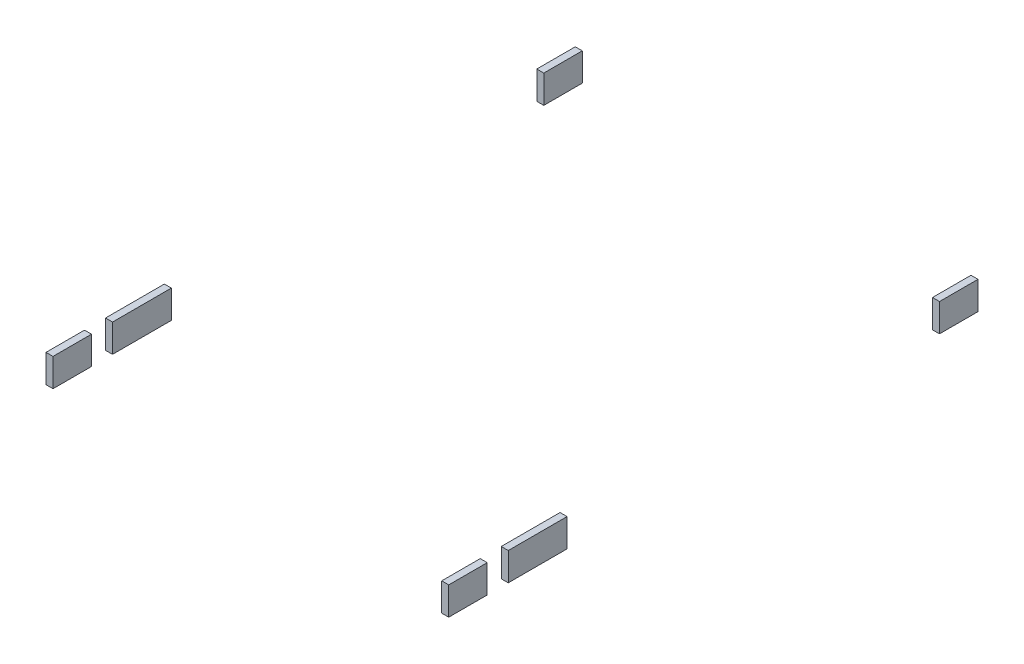
ISO-10303-21;
HEADER;
FILE_DESCRIPTION(('STEP AP214'),'2;1');
FILE_NAME('part.step','',(''),(''),'','','');
FILE_SCHEMA(('AUTOMOTIVE_DESIGN { 1 0 10303 214 1 1 1 1 }'));
ENDSEC;
DATA;
#1=APPLICATION_CONTEXT('core data for automotive mechanical design processes');
#2=APPLICATION_PROTOCOL_DEFINITION('international standard','automotive_design',2000,#1);
#3=PRODUCT_CONTEXT('',#1,'mechanical');
#4=PRODUCT('Part','Part','',(#3));
#5=PRODUCT_RELATED_PRODUCT_CATEGORY('part','',(#4));
#6=PRODUCT_DEFINITION_FORMATION('','',#4);
#7=PRODUCT_DEFINITION_CONTEXT('part definition',#1,'design');
#8=PRODUCT_DEFINITION('design','',#6,#7);
#9=PRODUCT_DEFINITION_SHAPE('','',#8);
#10=(LENGTH_UNIT() NAMED_UNIT(*) SI_UNIT(.MILLI.,.METRE.));
#11=(NAMED_UNIT(*) PLANE_ANGLE_UNIT() SI_UNIT($,.RADIAN.));
#12=(NAMED_UNIT(*) SI_UNIT($,.STERADIAN.) SOLID_ANGLE_UNIT());
#13=UNCERTAINTY_MEASURE_WITH_UNIT(LENGTH_MEASURE(1.E-05),#10,'distance_accuracy_value','');
#14=(GEOMETRIC_REPRESENTATION_CONTEXT(3) GLOBAL_UNCERTAINTY_ASSIGNED_CONTEXT((#13)) GLOBAL_UNIT_ASSIGNED_CONTEXT((#10,
#11,#12)) REPRESENTATION_CONTEXT('',''));
#15=CARTESIAN_POINT('',(0.,0.,0.));
#16=DIRECTION('',(0.,0.,1.));
#17=DIRECTION('',(1.,0.,0.));
#18=AXIS2_PLACEMENT_3D('',#15,#16,#17);
#19=CARTESIAN_POINT('',(-287.55,300.,670.));
#20=DIRECTION('',(0.,0.,-1.));
#21=DIRECTION('',(1.,0.,0.));
#22=AXIS2_PLACEMENT_3D('',#19,#20,#21);
#23=PLANE('',#22);
#24=DIRECTION('',(1.,0.,0.));
#25=VECTOR('',#24,1.);
#26=CARTESIAN_POINT('',(-287.55,300.,670.));
#27=LINE('',#26,#25);
#28=CARTESIAN_POINT('',(-287.55,300.,670.));
#29=VERTEX_POINT('',#28);
#30=CARTESIAN_POINT('',(-277.55,300.,670.));
#31=VERTEX_POINT('',#30);
#32=EDGE_CURVE('P0_E11',#29,#31,#27,.T.);
#33=ORIENTED_EDGE('',*,*,#32,.T.);
#34=DIRECTION('',(0.,1.,0.));
#35=VECTOR('',#34,1.);
#36=CARTESIAN_POINT('',(-277.55,300.,670.));
#37=LINE('',#36,#35);
#38=CARTESIAN_POINT('',(-277.55,340.,670.));
#39=VERTEX_POINT('',#38);
#40=EDGE_CURVE('P0_E26',#31,#39,#37,.T.);
#41=ORIENTED_EDGE('',*,*,#40,.T.);
#42=DIRECTION('',(1.,0.,0.));
#43=VECTOR('',#42,1.);
#44=CARTESIAN_POINT('',(-287.55,340.,670.));
#45=LINE('',#44,#43);
#46=CARTESIAN_POINT('',(-287.55,340.,670.));
#47=VERTEX_POINT('',#46);
#48=EDGE_CURVE('P0_E77',#47,#39,#45,.T.);
#49=ORIENTED_EDGE('',*,*,#48,.F.);
#50=DIRECTION('',(0.,1.,0.));
#51=VECTOR('',#50,1.);
#52=CARTESIAN_POINT('',(-287.55,300.,670.));
#53=LINE('',#52,#51);
#54=EDGE_CURVE('P0_E74',#29,#47,#53,.T.);
#55=ORIENTED_EDGE('',*,*,#54,.F.);
#56=EDGE_LOOP('',(#33,#41,#49,#55));
#57=FACE_BOUND('',#56,.T.);
#58=ADVANCED_FACE('P0_F16',(#57),#23,.F.);
#59=CARTESIAN_POINT('',(-277.55,300.,670.));
#60=DIRECTION('',(-1.,0.,0.));
#61=DIRECTION('',(0.,0.,-1.));
#62=AXIS2_PLACEMENT_3D('',#59,#60,#61);
#63=PLANE('',#62);
#64=DIRECTION('',(0.,0.,-1.));
#65=VECTOR('',#64,1.);
#66=CARTESIAN_POINT('',(-277.55,300.,670.));
#67=LINE('',#66,#65);
#68=CARTESIAN_POINT('',(-277.55,300.,615.));
#69=VERTEX_POINT('',#68);
#70=EDGE_CURVE('P0_E82',#31,#69,#67,.T.);
#71=ORIENTED_EDGE('',*,*,#70,.T.);
#72=DIRECTION('',(0.,1.,0.));
#73=VECTOR('',#72,1.);
#74=CARTESIAN_POINT('',(-277.55,300.,615.));
#75=LINE('',#74,#73);
#76=CARTESIAN_POINT('',(-277.55,340.,615.));
#77=VERTEX_POINT('',#76);
#78=EDGE_CURVE('P0_E84',#69,#77,#75,.T.);
#79=ORIENTED_EDGE('',*,*,#78,.T.);
#80=DIRECTION('',(0.,0.,-1.));
#81=VECTOR('',#80,1.);
#82=CARTESIAN_POINT('',(-277.55,340.,670.));
#83=LINE('',#82,#81);
#84=EDGE_CURVE('P0_E61',#39,#77,#83,.T.);
#85=ORIENTED_EDGE('',*,*,#84,.F.);
#86=ORIENTED_EDGE('',*,*,#40,.F.);
#87=EDGE_LOOP('',(#71,#79,#85,#86));
#88=FACE_BOUND('',#87,.T.);
#89=ADVANCED_FACE('P0_F87',(#88),#63,.F.);
#90=CARTESIAN_POINT('',(-277.55,300.,615.));
#91=DIRECTION('',(0.,0.,1.));
#92=DIRECTION('',(-1.,0.,0.));
#93=AXIS2_PLACEMENT_3D('',#90,#91,#92);
#94=PLANE('',#93);
#95=DIRECTION('',(-1.,0.,0.));
#96=VECTOR('',#95,1.);
#97=CARTESIAN_POINT('',(-277.55,300.,615.));
#98=LINE('',#97,#96);
#99=CARTESIAN_POINT('',(-287.55,300.,615.));
#100=VERTEX_POINT('',#99);
#101=EDGE_CURVE('P0_E67',#69,#100,#98,.T.);
#102=ORIENTED_EDGE('',*,*,#101,.T.);
#103=DIRECTION('',(0.,1.,0.));
#104=VECTOR('',#103,1.);
#105=CARTESIAN_POINT('',(-287.55,300.,615.));
#106=LINE('',#105,#104);
#107=CARTESIAN_POINT('',(-287.55,340.,615.));
#108=VERTEX_POINT('',#107);
#109=EDGE_CURVE('P0_E54',#100,#108,#106,.T.);
#110=ORIENTED_EDGE('',*,*,#109,.T.);
#111=DIRECTION('',(-1.,0.,0.));
#112=VECTOR('',#111,1.);
#113=CARTESIAN_POINT('',(-277.55,340.,615.));
#114=LINE('',#113,#112);
#115=EDGE_CURVE('P0_E60',#77,#108,#114,.T.);
#116=ORIENTED_EDGE('',*,*,#115,.F.);
#117=ORIENTED_EDGE('',*,*,#78,.F.);
#118=EDGE_LOOP('',(#102,#110,#116,#117));
#119=FACE_BOUND('',#118,.T.);
#120=ADVANCED_FACE('P0_F65',(#119),#94,.F.);
#121=CARTESIAN_POINT('',(-287.55,300.,615.));
#122=DIRECTION('',(1.,0.,0.));
#123=DIRECTION('',(0.,0.,1.));
#124=AXIS2_PLACEMENT_3D('',#121,#122,#123);
#125=PLANE('',#124);
#126=DIRECTION('',(0.,0.,1.));
#127=VECTOR('',#126,1.);
#128=CARTESIAN_POINT('',(-287.55,300.,615.));
#129=LINE('',#128,#127);
#130=EDGE_CURVE('P0_E69',#100,#29,#129,.T.);
#131=ORIENTED_EDGE('',*,*,#130,.T.);
#132=ORIENTED_EDGE('',*,*,#54,.T.);
#133=DIRECTION('',(0.,0.,1.));
#134=VECTOR('',#133,1.);
#135=CARTESIAN_POINT('',(-287.55,340.,615.));
#136=LINE('',#135,#134);
#137=EDGE_CURVE('P0_E20',#108,#47,#136,.T.);
#138=ORIENTED_EDGE('',*,*,#137,.F.);
#139=ORIENTED_EDGE('',*,*,#109,.F.);
#140=EDGE_LOOP('',(#131,#132,#138,#139));
#141=FACE_BOUND('',#140,.T.);
#142=ADVANCED_FACE('P0_F72',(#141),#125,.F.);
#143=CARTESIAN_POINT('',(0.,300.,1098.183990133));
#144=DIRECTION('',(0.,1.,0.));
#145=DIRECTION('',(0.,0.,1.));
#146=AXIS2_PLACEMENT_3D('',#143,#144,#145);
#147=PLANE('',#146);
#148=ORIENTED_EDGE('',*,*,#130,.F.);
#149=ORIENTED_EDGE('',*,*,#101,.F.);
#150=ORIENTED_EDGE('',*,*,#70,.F.);
#151=ORIENTED_EDGE('',*,*,#32,.F.);
#152=EDGE_LOOP('',(#148,#149,#150,#151));
#153=FACE_BOUND('',#152,.T.);
#154=ADVANCED_FACE('P0_F90',(#153),#147,.F.);
#155=CARTESIAN_POINT('',(0.,340.,1098.183990133));
#156=DIRECTION('',(0.,1.,0.));
#157=DIRECTION('',(0.,0.,1.));
#158=AXIS2_PLACEMENT_3D('',#155,#156,#157);
#159=PLANE('',#158);
#160=ORIENTED_EDGE('',*,*,#48,.T.);
#161=ORIENTED_EDGE('',*,*,#84,.T.);
#162=ORIENTED_EDGE('',*,*,#115,.T.);
#163=ORIENTED_EDGE('',*,*,#137,.T.);
#164=EDGE_LOOP('',(#160,#161,#162,#163));
#165=FACE_BOUND('',#164,.T.);
#166=ADVANCED_FACE('P0_F18',(#165),#159,.T.);
#167=CLOSED_SHELL('',(#58,#89,#120,#142,#154,#166));
#168=MANIFOLD_SOLID_BREP('P0_B1',#167);
#169=CARTESIAN_POINT('',(287.55,300.,1370.8));
#170=DIRECTION('',(0.,0.,1.));
#171=DIRECTION('',(-1.,0.,0.));
#172=AXIS2_PLACEMENT_3D('',#169,#170,#171);
#173=PLANE('',#172);
#174=DIRECTION('',(0.,1.,0.));
#175=VECTOR('',#174,1.);
#176=CARTESIAN_POINT('',(287.55,300.,1370.8));
#177=LINE('',#176,#175);
#178=CARTESIAN_POINT('',(287.55,300.,1370.8));
#179=VERTEX_POINT('',#178);
#180=CARTESIAN_POINT('',(287.55,340.,1370.8));
#181=VERTEX_POINT('',#180);
#182=EDGE_CURVE('P1_E11',#179,#181,#177,.T.);
#183=ORIENTED_EDGE('',*,*,#182,.T.);
#184=DIRECTION('',(-1.,0.,0.));
#185=VECTOR('',#184,1.);
#186=CARTESIAN_POINT('',(287.55,340.,1370.8));
#187=LINE('',#186,#185);
#188=CARTESIAN_POINT('',(277.55,340.,1370.8));
#189=VERTEX_POINT('',#188);
#190=EDGE_CURVE('P1_E26',#181,#189,#187,.T.);
#191=ORIENTED_EDGE('',*,*,#190,.T.);
#192=DIRECTION('',(0.,1.,0.));
#193=VECTOR('',#192,1.);
#194=CARTESIAN_POINT('',(277.55,300.,1370.8));
#195=LINE('',#194,#193);
#196=CARTESIAN_POINT('',(277.55,300.,1370.8));
#197=VERTEX_POINT('',#196);
#198=EDGE_CURVE('P1_E78',#197,#189,#195,.T.);
#199=ORIENTED_EDGE('',*,*,#198,.F.);
#200=DIRECTION('',(-1.,0.,0.));
#201=VECTOR('',#200,1.);
#202=CARTESIAN_POINT('',(287.55,300.,1370.8));
#203=LINE('',#202,#201);
#204=EDGE_CURVE('P1_E77',#179,#197,#203,.T.);
#205=ORIENTED_EDGE('',*,*,#204,.F.);
#206=EDGE_LOOP('',(#183,#191,#199,#205));
#207=FACE_BOUND('',#206,.T.);
#208=ADVANCED_FACE('P1_F16',(#207),#173,.T.);
#209=CARTESIAN_POINT('',(277.55,300.,1370.8));
#210=DIRECTION('',(-1.,0.,0.));
#211=DIRECTION('',(0.,0.,-1.));
#212=AXIS2_PLACEMENT_3D('',#209,#210,#211);
#213=PLANE('',#212);
#214=ORIENTED_EDGE('',*,*,#198,.T.);
#215=DIRECTION('',(0.,0.,-1.));
#216=VECTOR('',#215,1.);
#217=CARTESIAN_POINT('',(277.55,340.,1370.8));
#218=LINE('',#217,#216);
#219=CARTESIAN_POINT('',(277.55,340.,1315.8));
#220=VERTEX_POINT('',#219);
#221=EDGE_CURVE('P1_E84',#189,#220,#218,.T.);
#222=ORIENTED_EDGE('',*,*,#221,.T.);
#223=DIRECTION('',(0.,1.,0.));
#224=VECTOR('',#223,1.);
#225=CARTESIAN_POINT('',(277.55,300.,1315.8));
#226=LINE('',#225,#224);
#227=CARTESIAN_POINT('',(277.55,300.,1315.8));
#228=VERTEX_POINT('',#227);
#229=EDGE_CURVE('P1_E87',#228,#220,#226,.T.);
#230=ORIENTED_EDGE('',*,*,#229,.F.);
#231=DIRECTION('',(0.,0.,-1.));
#232=VECTOR('',#231,1.);
#233=CARTESIAN_POINT('',(277.55,300.,1370.8));
#234=LINE('',#233,#232);
#235=EDGE_CURVE('P1_E63',#197,#228,#234,.T.);
#236=ORIENTED_EDGE('',*,*,#235,.F.);
#237=EDGE_LOOP('',(#214,#222,#230,#236));
#238=FACE_BOUND('',#237,.T.);
#239=ADVANCED_FACE('P1_F90',(#238),#213,.T.);
#240=CARTESIAN_POINT('',(277.55,300.,1315.8));
#241=DIRECTION('',(0.,0.,-1.));
#242=DIRECTION('',(1.,0.,0.));
#243=AXIS2_PLACEMENT_3D('',#240,#241,#242);
#244=PLANE('',#243);
#245=ORIENTED_EDGE('',*,*,#229,.T.);
#246=DIRECTION('',(1.,0.,0.));
#247=VECTOR('',#246,1.);
#248=CARTESIAN_POINT('',(277.55,340.,1315.8));
#249=LINE('',#248,#247);
#250=CARTESIAN_POINT('',(287.55,340.,1315.8));
#251=VERTEX_POINT('',#250);
#252=EDGE_CURVE('P1_E69',#220,#251,#249,.T.);
#253=ORIENTED_EDGE('',*,*,#252,.T.);
#254=DIRECTION('',(0.,1.,0.));
#255=VECTOR('',#254,1.);
#256=CARTESIAN_POINT('',(287.55,300.,1315.8));
#257=LINE('',#256,#255);
#258=CARTESIAN_POINT('',(287.55,300.,1315.8));
#259=VERTEX_POINT('',#258);
#260=EDGE_CURVE('P1_E54',#259,#251,#257,.T.);
#261=ORIENTED_EDGE('',*,*,#260,.F.);
#262=DIRECTION('',(1.,0.,0.));
#263=VECTOR('',#262,1.);
#264=CARTESIAN_POINT('',(277.55,300.,1315.8));
#265=LINE('',#264,#263);
#266=EDGE_CURVE('P1_E60',#228,#259,#265,.T.);
#267=ORIENTED_EDGE('',*,*,#266,.F.);
#268=EDGE_LOOP('',(#245,#253,#261,#267));
#269=FACE_BOUND('',#268,.T.);
#270=ADVANCED_FACE('P1_F67',(#269),#244,.T.);
#271=CARTESIAN_POINT('',(287.55,300.,1315.8));
#272=DIRECTION('',(1.,0.,0.));
#273=DIRECTION('',(0.,0.,1.));
#274=AXIS2_PLACEMENT_3D('',#271,#272,#273);
#275=PLANE('',#274);
#276=ORIENTED_EDGE('',*,*,#260,.T.);
#277=DIRECTION('',(0.,0.,1.));
#278=VECTOR('',#277,1.);
#279=CARTESIAN_POINT('',(287.55,340.,1315.8));
#280=LINE('',#279,#278);
#281=EDGE_CURVE('P1_E70',#251,#181,#280,.T.);
#282=ORIENTED_EDGE('',*,*,#281,.T.);
#283=ORIENTED_EDGE('',*,*,#182,.F.);
#284=DIRECTION('',(0.,0.,1.));
#285=VECTOR('',#284,1.);
#286=CARTESIAN_POINT('',(287.55,300.,1315.8));
#287=LINE('',#286,#285);
#288=EDGE_CURVE('P1_E20',#259,#179,#287,.T.);
#289=ORIENTED_EDGE('',*,*,#288,.F.);
#290=EDGE_LOOP('',(#276,#282,#283,#289));
#291=FACE_BOUND('',#290,.T.);
#292=ADVANCED_FACE('P1_F73',(#291),#275,.T.);
#293=CARTESIAN_POINT('',(0.,300.,1098.183990133));
#294=DIRECTION('',(0.,1.,0.));
#295=DIRECTION('',(0.,0.,1.));
#296=AXIS2_PLACEMENT_3D('',#293,#294,#295);
#297=PLANE('',#296);
#298=ORIENTED_EDGE('',*,*,#204,.T.);
#299=ORIENTED_EDGE('',*,*,#235,.T.);
#300=ORIENTED_EDGE('',*,*,#266,.T.);
#301=ORIENTED_EDGE('',*,*,#288,.T.);
#302=EDGE_LOOP('',(#298,#299,#300,#301));
#303=FACE_BOUND('',#302,.T.);
#304=ADVANCED_FACE('P1_F61',(#303),#297,.F.);
#305=CARTESIAN_POINT('',(0.,340.,1098.183990133));
#306=DIRECTION('',(0.,1.,0.));
#307=DIRECTION('',(0.,0.,1.));
#308=AXIS2_PLACEMENT_3D('',#305,#306,#307);
#309=PLANE('',#308);
#310=ORIENTED_EDGE('',*,*,#281,.F.);
#311=ORIENTED_EDGE('',*,*,#252,.F.);
#312=ORIENTED_EDGE('',*,*,#221,.F.);
#313=ORIENTED_EDGE('',*,*,#190,.F.);
#314=EDGE_LOOP('',(#310,#311,#312,#313));
#315=FACE_BOUND('',#314,.T.);
#316=ADVANCED_FACE('P1_F18',(#315),#309,.T.);
#317=CLOSED_SHELL('',(#208,#239,#270,#292,#304,#316));
#318=MANIFOLD_SOLID_BREP('P1_B1',#317);
#319=CARTESIAN_POINT('',(287.55,300.,1201.81));
#320=DIRECTION('',(0.,0.,1.));
#321=DIRECTION('',(-1.,0.,0.));
#322=AXIS2_PLACEMENT_3D('',#319,#320,#321);
#323=PLANE('',#322);
#324=DIRECTION('',(-1.,0.,0.));
#325=VECTOR('',#324,1.);
#326=CARTESIAN_POINT('',(287.55,300.,1201.81));
#327=LINE('',#326,#325);
#328=CARTESIAN_POINT('',(287.55,300.,1201.81));
#329=VERTEX_POINT('',#328);
#330=CARTESIAN_POINT('',(277.55,300.,1201.81));
#331=VERTEX_POINT('',#330);
#332=EDGE_CURVE('P2_E11',#329,#331,#327,.T.);
#333=ORIENTED_EDGE('',*,*,#332,.T.);
#334=DIRECTION('',(0.,1.,0.));
#335=VECTOR('',#334,1.);
#336=CARTESIAN_POINT('',(277.55,300.,1201.81));
#337=LINE('',#336,#335);
#338=CARTESIAN_POINT('',(277.55,340.,1201.81));
#339=VERTEX_POINT('',#338);
#340=EDGE_CURVE('P2_E26',#331,#339,#337,.T.);
#341=ORIENTED_EDGE('',*,*,#340,.T.);
#342=DIRECTION('',(-1.,0.,0.));
#343=VECTOR('',#342,1.);
#344=CARTESIAN_POINT('',(287.55,340.,1201.81));
#345=LINE('',#344,#343);
#346=CARTESIAN_POINT('',(287.55,340.,1201.81));
#347=VERTEX_POINT('',#346);
#348=EDGE_CURVE('P2_E77',#347,#339,#345,.T.);
#349=ORIENTED_EDGE('',*,*,#348,.F.);
#350=DIRECTION('',(0.,1.,0.));
#351=VECTOR('',#350,1.);
#352=CARTESIAN_POINT('',(287.55,300.,1201.81));
#353=LINE('',#352,#351);
#354=EDGE_CURVE('P2_E74',#329,#347,#353,.T.);
#355=ORIENTED_EDGE('',*,*,#354,.F.);
#356=EDGE_LOOP('',(#333,#341,#349,#355));
#357=FACE_BOUND('',#356,.T.);
#358=ADVANCED_FACE('P2_F16',(#357),#323,.F.);
#359=CARTESIAN_POINT('',(277.55,300.,1201.81));
#360=DIRECTION('',(1.,0.,0.));
#361=DIRECTION('',(0.,0.,1.));
#362=AXIS2_PLACEMENT_3D('',#359,#360,#361);
#363=PLANE('',#362);
#364=DIRECTION('',(0.,0.,1.));
#365=VECTOR('',#364,1.);
#366=CARTESIAN_POINT('',(277.55,300.,1201.81));
#367=LINE('',#366,#365);
#368=CARTESIAN_POINT('',(277.55,300.,1285.8));
#369=VERTEX_POINT('',#368);
#370=EDGE_CURVE('P2_E82',#331,#369,#367,.T.);
#371=ORIENTED_EDGE('',*,*,#370,.T.);
#372=DIRECTION('',(0.,1.,0.));
#373=VECTOR('',#372,1.);
#374=CARTESIAN_POINT('',(277.55,300.,1285.8));
#375=LINE('',#374,#373);
#376=CARTESIAN_POINT('',(277.55,340.,1285.8));
#377=VERTEX_POINT('',#376);
#378=EDGE_CURVE('P2_E84',#369,#377,#375,.T.);
#379=ORIENTED_EDGE('',*,*,#378,.T.);
#380=DIRECTION('',(0.,0.,1.));
#381=VECTOR('',#380,1.);
#382=CARTESIAN_POINT('',(277.55,340.,1201.81));
#383=LINE('',#382,#381);
#384=EDGE_CURVE('P2_E61',#339,#377,#383,.T.);
#385=ORIENTED_EDGE('',*,*,#384,.F.);
#386=ORIENTED_EDGE('',*,*,#340,.F.);
#387=EDGE_LOOP('',(#371,#379,#385,#386));
#388=FACE_BOUND('',#387,.T.);
#389=ADVANCED_FACE('P2_F87',(#388),#363,.F.);
#390=CARTESIAN_POINT('',(277.55,300.,1285.8));
#391=DIRECTION('',(0.,0.,-1.));
#392=DIRECTION('',(1.,0.,0.));
#393=AXIS2_PLACEMENT_3D('',#390,#391,#392);
#394=PLANE('',#393);
#395=DIRECTION('',(1.,0.,0.));
#396=VECTOR('',#395,1.);
#397=CARTESIAN_POINT('',(277.55,300.,1285.8));
#398=LINE('',#397,#396);
#399=CARTESIAN_POINT('',(287.55,300.,1285.8));
#400=VERTEX_POINT('',#399);
#401=EDGE_CURVE('P2_E67',#369,#400,#398,.T.);
#402=ORIENTED_EDGE('',*,*,#401,.T.);
#403=DIRECTION('',(0.,1.,0.));
#404=VECTOR('',#403,1.);
#405=CARTESIAN_POINT('',(287.55,300.,1285.8));
#406=LINE('',#405,#404);
#407=CARTESIAN_POINT('',(287.55,340.,1285.8));
#408=VERTEX_POINT('',#407);
#409=EDGE_CURVE('P2_E54',#400,#408,#406,.T.);
#410=ORIENTED_EDGE('',*,*,#409,.T.);
#411=DIRECTION('',(1.,0.,0.));
#412=VECTOR('',#411,1.);
#413=CARTESIAN_POINT('',(277.55,340.,1285.8));
#414=LINE('',#413,#412);
#415=EDGE_CURVE('P2_E60',#377,#408,#414,.T.);
#416=ORIENTED_EDGE('',*,*,#415,.F.);
#417=ORIENTED_EDGE('',*,*,#378,.F.);
#418=EDGE_LOOP('',(#402,#410,#416,#417));
#419=FACE_BOUND('',#418,.T.);
#420=ADVANCED_FACE('P2_F65',(#419),#394,.F.);
#421=CARTESIAN_POINT('',(287.55,300.,1285.8));
#422=DIRECTION('',(-1.,0.,0.));
#423=DIRECTION('',(0.,0.,-1.));
#424=AXIS2_PLACEMENT_3D('',#421,#422,#423);
#425=PLANE('',#424);
#426=DIRECTION('',(0.,0.,-1.));
#427=VECTOR('',#426,1.);
#428=CARTESIAN_POINT('',(287.55,300.,1285.8));
#429=LINE('',#428,#427);
#430=EDGE_CURVE('P2_E69',#400,#329,#429,.T.);
#431=ORIENTED_EDGE('',*,*,#430,.T.);
#432=ORIENTED_EDGE('',*,*,#354,.T.);
#433=DIRECTION('',(0.,0.,-1.));
#434=VECTOR('',#433,1.);
#435=CARTESIAN_POINT('',(287.55,340.,1285.8));
#436=LINE('',#435,#434);
#437=EDGE_CURVE('P2_E20',#408,#347,#436,.T.);
#438=ORIENTED_EDGE('',*,*,#437,.F.);
#439=ORIENTED_EDGE('',*,*,#409,.F.);
#440=EDGE_LOOP('',(#431,#432,#438,#439));
#441=FACE_BOUND('',#440,.T.);
#442=ADVANCED_FACE('P2_F72',(#441),#425,.F.);
#443=CARTESIAN_POINT('',(0.,300.,1098.183990133));
#444=DIRECTION('',(0.,1.,0.));
#445=DIRECTION('',(0.,0.,1.));
#446=AXIS2_PLACEMENT_3D('',#443,#444,#445);
#447=PLANE('',#446);
#448=ORIENTED_EDGE('',*,*,#430,.F.);
#449=ORIENTED_EDGE('',*,*,#401,.F.);
#450=ORIENTED_EDGE('',*,*,#370,.F.);
#451=ORIENTED_EDGE('',*,*,#332,.F.);
#452=EDGE_LOOP('',(#448,#449,#450,#451));
#453=FACE_BOUND('',#452,.T.);
#454=ADVANCED_FACE('P2_F90',(#453),#447,.F.);
#455=CARTESIAN_POINT('',(0.,340.,1098.183990133));
#456=DIRECTION('',(0.,1.,0.));
#457=DIRECTION('',(0.,0.,1.));
#458=AXIS2_PLACEMENT_3D('',#455,#456,#457);
#459=PLANE('',#458);
#460=ORIENTED_EDGE('',*,*,#348,.T.);
#461=ORIENTED_EDGE('',*,*,#384,.T.);
#462=ORIENTED_EDGE('',*,*,#415,.T.);
#463=ORIENTED_EDGE('',*,*,#437,.T.);
#464=EDGE_LOOP('',(#460,#461,#462,#463));
#465=FACE_BOUND('',#464,.T.);
#466=ADVANCED_FACE('P2_F18',(#465),#459,.T.);
#467=CLOSED_SHELL('',(#358,#389,#420,#442,#454,#466));
#468=MANIFOLD_SOLID_BREP('P2_B1',#467);
#469=CARTESIAN_POINT('',(-287.55,300.,1370.8));
#470=DIRECTION('',(0.,0.,-1.));
#471=DIRECTION('',(1.,0.,0.));
#472=AXIS2_PLACEMENT_3D('',#469,#470,#471);
#473=PLANE('',#472);
#474=DIRECTION('',(1.,0.,0.));
#475=VECTOR('',#474,1.);
#476=CARTESIAN_POINT('',(-287.55,300.,1370.8));
#477=LINE('',#476,#475);
#478=CARTESIAN_POINT('',(-287.55,300.,1370.8));
#479=VERTEX_POINT('',#478);
#480=CARTESIAN_POINT('',(-277.55,300.,1370.8));
#481=VERTEX_POINT('',#480);
#482=EDGE_CURVE('P3_E11',#479,#481,#477,.T.);
#483=ORIENTED_EDGE('',*,*,#482,.T.);
#484=DIRECTION('',(0.,1.,0.));
#485=VECTOR('',#484,1.);
#486=CARTESIAN_POINT('',(-277.55,300.,1370.8));
#487=LINE('',#486,#485);
#488=CARTESIAN_POINT('',(-277.55,340.,1370.8));
#489=VERTEX_POINT('',#488);
#490=EDGE_CURVE('P3_E26',#481,#489,#487,.T.);
#491=ORIENTED_EDGE('',*,*,#490,.T.);
#492=DIRECTION('',(1.,0.,0.));
#493=VECTOR('',#492,1.);
#494=CARTESIAN_POINT('',(-287.55,340.,1370.8));
#495=LINE('',#494,#493);
#496=CARTESIAN_POINT('',(-287.55,340.,1370.8));
#497=VERTEX_POINT('',#496);
#498=EDGE_CURVE('P3_E77',#497,#489,#495,.T.);
#499=ORIENTED_EDGE('',*,*,#498,.F.);
#500=DIRECTION('',(0.,1.,0.));
#501=VECTOR('',#500,1.);
#502=CARTESIAN_POINT('',(-287.55,300.,1370.8));
#503=LINE('',#502,#501);
#504=EDGE_CURVE('P3_E74',#479,#497,#503,.T.);
#505=ORIENTED_EDGE('',*,*,#504,.F.);
#506=EDGE_LOOP('',(#483,#491,#499,#505));
#507=FACE_BOUND('',#506,.T.);
#508=ADVANCED_FACE('P3_F16',(#507),#473,.F.);
#509=CARTESIAN_POINT('',(-277.55,300.,1370.8));
#510=DIRECTION('',(-1.,0.,0.));
#511=DIRECTION('',(0.,0.,-1.));
#512=AXIS2_PLACEMENT_3D('',#509,#510,#511);
#513=PLANE('',#512);
#514=DIRECTION('',(0.,0.,-1.));
#515=VECTOR('',#514,1.);
#516=CARTESIAN_POINT('',(-277.55,300.,1370.8));
#517=LINE('',#516,#515);
#518=CARTESIAN_POINT('',(-277.55,300.,1315.8));
#519=VERTEX_POINT('',#518);
#520=EDGE_CURVE('P3_E82',#481,#519,#517,.T.);
#521=ORIENTED_EDGE('',*,*,#520,.T.);
#522=DIRECTION('',(0.,1.,0.));
#523=VECTOR('',#522,1.);
#524=CARTESIAN_POINT('',(-277.55,300.,1315.8));
#525=LINE('',#524,#523);
#526=CARTESIAN_POINT('',(-277.55,340.,1315.8));
#527=VERTEX_POINT('',#526);
#528=EDGE_CURVE('P3_E84',#519,#527,#525,.T.);
#529=ORIENTED_EDGE('',*,*,#528,.T.);
#530=DIRECTION('',(0.,0.,-1.));
#531=VECTOR('',#530,1.);
#532=CARTESIAN_POINT('',(-277.55,340.,1370.8));
#533=LINE('',#532,#531);
#534=EDGE_CURVE('P3_E61',#489,#527,#533,.T.);
#535=ORIENTED_EDGE('',*,*,#534,.F.);
#536=ORIENTED_EDGE('',*,*,#490,.F.);
#537=EDGE_LOOP('',(#521,#529,#535,#536));
#538=FACE_BOUND('',#537,.T.);
#539=ADVANCED_FACE('P3_F87',(#538),#513,.F.);
#540=CARTESIAN_POINT('',(-277.55,300.,1315.8));
#541=DIRECTION('',(0.,0.,1.));
#542=DIRECTION('',(-1.,0.,0.));
#543=AXIS2_PLACEMENT_3D('',#540,#541,#542);
#544=PLANE('',#543);
#545=DIRECTION('',(-1.,0.,0.));
#546=VECTOR('',#545,1.);
#547=CARTESIAN_POINT('',(-277.55,300.,1315.8));
#548=LINE('',#547,#546);
#549=CARTESIAN_POINT('',(-287.55,300.,1315.8));
#550=VERTEX_POINT('',#549);
#551=EDGE_CURVE('P3_E67',#519,#550,#548,.T.);
#552=ORIENTED_EDGE('',*,*,#551,.T.);
#553=DIRECTION('',(0.,1.,0.));
#554=VECTOR('',#553,1.);
#555=CARTESIAN_POINT('',(-287.55,300.,1315.8));
#556=LINE('',#555,#554);
#557=CARTESIAN_POINT('',(-287.55,340.,1315.8));
#558=VERTEX_POINT('',#557);
#559=EDGE_CURVE('P3_E54',#550,#558,#556,.T.);
#560=ORIENTED_EDGE('',*,*,#559,.T.);
#561=DIRECTION('',(-1.,0.,0.));
#562=VECTOR('',#561,1.);
#563=CARTESIAN_POINT('',(-277.55,340.,1315.8));
#564=LINE('',#563,#562);
#565=EDGE_CURVE('P3_E60',#527,#558,#564,.T.);
#566=ORIENTED_EDGE('',*,*,#565,.F.);
#567=ORIENTED_EDGE('',*,*,#528,.F.);
#568=EDGE_LOOP('',(#552,#560,#566,#567));
#569=FACE_BOUND('',#568,.T.);
#570=ADVANCED_FACE('P3_F65',(#569),#544,.F.);
#571=CARTESIAN_POINT('',(-287.55,300.,1315.8));
#572=DIRECTION('',(1.,0.,0.));
#573=DIRECTION('',(0.,0.,1.));
#574=AXIS2_PLACEMENT_3D('',#571,#572,#573);
#575=PLANE('',#574);
#576=DIRECTION('',(0.,0.,1.));
#577=VECTOR('',#576,1.);
#578=CARTESIAN_POINT('',(-287.55,300.,1315.8));
#579=LINE('',#578,#577);
#580=EDGE_CURVE('P3_E69',#550,#479,#579,.T.);
#581=ORIENTED_EDGE('',*,*,#580,.T.);
#582=ORIENTED_EDGE('',*,*,#504,.T.);
#583=DIRECTION('',(0.,0.,1.));
#584=VECTOR('',#583,1.);
#585=CARTESIAN_POINT('',(-287.55,340.,1315.8));
#586=LINE('',#585,#584);
#587=EDGE_CURVE('P3_E20',#558,#497,#586,.T.);
#588=ORIENTED_EDGE('',*,*,#587,.F.);
#589=ORIENTED_EDGE('',*,*,#559,.F.);
#590=EDGE_LOOP('',(#581,#582,#588,#589));
#591=FACE_BOUND('',#590,.T.);
#592=ADVANCED_FACE('P3_F72',(#591),#575,.F.);
#593=CARTESIAN_POINT('',(0.,300.,1098.183990133));
#594=DIRECTION('',(0.,1.,0.));
#595=DIRECTION('',(0.,0.,1.));
#596=AXIS2_PLACEMENT_3D('',#593,#594,#595);
#597=PLANE('',#596);
#598=ORIENTED_EDGE('',*,*,#580,.F.);
#599=ORIENTED_EDGE('',*,*,#551,.F.);
#600=ORIENTED_EDGE('',*,*,#520,.F.);
#601=ORIENTED_EDGE('',*,*,#482,.F.);
#602=EDGE_LOOP('',(#598,#599,#600,#601));
#603=FACE_BOUND('',#602,.T.);
#604=ADVANCED_FACE('P3_F90',(#603),#597,.F.);
#605=CARTESIAN_POINT('',(0.,340.,1098.183990133));
#606=DIRECTION('',(0.,1.,0.));
#607=DIRECTION('',(0.,0.,1.));
#608=AXIS2_PLACEMENT_3D('',#605,#606,#607);
#609=PLANE('',#608);
#610=ORIENTED_EDGE('',*,*,#498,.T.);
#611=ORIENTED_EDGE('',*,*,#534,.T.);
#612=ORIENTED_EDGE('',*,*,#565,.T.);
#613=ORIENTED_EDGE('',*,*,#587,.T.);
#614=EDGE_LOOP('',(#610,#611,#612,#613));
#615=FACE_BOUND('',#614,.T.);
#616=ADVANCED_FACE('P3_F18',(#615),#609,.T.);
#617=CLOSED_SHELL('',(#508,#539,#570,#592,#604,#616));
#618=MANIFOLD_SOLID_BREP('P3_B1',#617);
#619=CARTESIAN_POINT('',(287.55,300.,670.));
#620=DIRECTION('',(0.,0.,1.));
#621=DIRECTION('',(-1.,0.,0.));
#622=AXIS2_PLACEMENT_3D('',#619,#620,#621);
#623=PLANE('',#622);
#624=DIRECTION('',(0.,1.,0.));
#625=VECTOR('',#624,1.);
#626=CARTESIAN_POINT('',(287.55,300.,670.));
#627=LINE('',#626,#625);
#628=CARTESIAN_POINT('',(287.55,300.,670.));
#629=VERTEX_POINT('',#628);
#630=CARTESIAN_POINT('',(287.55,340.,670.));
#631=VERTEX_POINT('',#630);
#632=EDGE_CURVE('P4_E11',#629,#631,#627,.T.);
#633=ORIENTED_EDGE('',*,*,#632,.T.);
#634=DIRECTION('',(-1.,0.,0.));
#635=VECTOR('',#634,1.);
#636=CARTESIAN_POINT('',(287.55,340.,670.));
#637=LINE('',#636,#635);
#638=CARTESIAN_POINT('',(277.55,340.,670.));
#639=VERTEX_POINT('',#638);
#640=EDGE_CURVE('P4_E26',#631,#639,#637,.T.);
#641=ORIENTED_EDGE('',*,*,#640,.T.);
#642=DIRECTION('',(0.,1.,0.));
#643=VECTOR('',#642,1.);
#644=CARTESIAN_POINT('',(277.55,300.,670.));
#645=LINE('',#644,#643);
#646=CARTESIAN_POINT('',(277.55,300.,670.));
#647=VERTEX_POINT('',#646);
#648=EDGE_CURVE('P4_E78',#647,#639,#645,.T.);
#649=ORIENTED_EDGE('',*,*,#648,.F.);
#650=DIRECTION('',(-1.,0.,0.));
#651=VECTOR('',#650,1.);
#652=CARTESIAN_POINT('',(287.55,300.,670.));
#653=LINE('',#652,#651);
#654=EDGE_CURVE('P4_E77',#629,#647,#653,.T.);
#655=ORIENTED_EDGE('',*,*,#654,.F.);
#656=EDGE_LOOP('',(#633,#641,#649,#655));
#657=FACE_BOUND('',#656,.T.);
#658=ADVANCED_FACE('P4_F16',(#657),#623,.T.);
#659=CARTESIAN_POINT('',(277.55,300.,670.));
#660=DIRECTION('',(-1.,0.,0.));
#661=DIRECTION('',(0.,0.,-1.));
#662=AXIS2_PLACEMENT_3D('',#659,#660,#661);
#663=PLANE('',#662);
#664=ORIENTED_EDGE('',*,*,#648,.T.);
#665=DIRECTION('',(0.,0.,-1.));
#666=VECTOR('',#665,1.);
#667=CARTESIAN_POINT('',(277.55,340.,670.));
#668=LINE('',#667,#666);
#669=CARTESIAN_POINT('',(277.55,340.,615.));
#670=VERTEX_POINT('',#669);
#671=EDGE_CURVE('P4_E84',#639,#670,#668,.T.);
#672=ORIENTED_EDGE('',*,*,#671,.T.);
#673=DIRECTION('',(0.,1.,0.));
#674=VECTOR('',#673,1.);
#675=CARTESIAN_POINT('',(277.55,300.,615.));
#676=LINE('',#675,#674);
#677=CARTESIAN_POINT('',(277.55,300.,615.));
#678=VERTEX_POINT('',#677);
#679=EDGE_CURVE('P4_E87',#678,#670,#676,.T.);
#680=ORIENTED_EDGE('',*,*,#679,.F.);
#681=DIRECTION('',(0.,0.,-1.));
#682=VECTOR('',#681,1.);
#683=CARTESIAN_POINT('',(277.55,300.,670.));
#684=LINE('',#683,#682);
#685=EDGE_CURVE('P4_E63',#647,#678,#684,.T.);
#686=ORIENTED_EDGE('',*,*,#685,.F.);
#687=EDGE_LOOP('',(#664,#672,#680,#686));
#688=FACE_BOUND('',#687,.T.);
#689=ADVANCED_FACE('P4_F90',(#688),#663,.T.);
#690=CARTESIAN_POINT('',(277.55,300.,615.));
#691=DIRECTION('',(0.,0.,-1.));
#692=DIRECTION('',(1.,0.,0.));
#693=AXIS2_PLACEMENT_3D('',#690,#691,#692);
#694=PLANE('',#693);
#695=ORIENTED_EDGE('',*,*,#679,.T.);
#696=DIRECTION('',(1.,0.,0.));
#697=VECTOR('',#696,1.);
#698=CARTESIAN_POINT('',(277.55,340.,615.));
#699=LINE('',#698,#697);
#700=CARTESIAN_POINT('',(287.55,340.,615.));
#701=VERTEX_POINT('',#700);
#702=EDGE_CURVE('P4_E69',#670,#701,#699,.T.);
#703=ORIENTED_EDGE('',*,*,#702,.T.);
#704=DIRECTION('',(0.,1.,0.));
#705=VECTOR('',#704,1.);
#706=CARTESIAN_POINT('',(287.55,300.,615.));
#707=LINE('',#706,#705);
#708=CARTESIAN_POINT('',(287.55,300.,615.));
#709=VERTEX_POINT('',#708);
#710=EDGE_CURVE('P4_E54',#709,#701,#707,.T.);
#711=ORIENTED_EDGE('',*,*,#710,.F.);
#712=DIRECTION('',(1.,0.,0.));
#713=VECTOR('',#712,1.);
#714=CARTESIAN_POINT('',(277.55,300.,615.));
#715=LINE('',#714,#713);
#716=EDGE_CURVE('P4_E60',#678,#709,#715,.T.);
#717=ORIENTED_EDGE('',*,*,#716,.F.);
#718=EDGE_LOOP('',(#695,#703,#711,#717));
#719=FACE_BOUND('',#718,.T.);
#720=ADVANCED_FACE('P4_F67',(#719),#694,.T.);
#721=CARTESIAN_POINT('',(287.55,300.,615.));
#722=DIRECTION('',(1.,0.,0.));
#723=DIRECTION('',(0.,0.,1.));
#724=AXIS2_PLACEMENT_3D('',#721,#722,#723);
#725=PLANE('',#724);
#726=ORIENTED_EDGE('',*,*,#710,.T.);
#727=DIRECTION('',(0.,0.,1.));
#728=VECTOR('',#727,1.);
#729=CARTESIAN_POINT('',(287.55,340.,615.));
#730=LINE('',#729,#728);
#731=EDGE_CURVE('P4_E70',#701,#631,#730,.T.);
#732=ORIENTED_EDGE('',*,*,#731,.T.);
#733=ORIENTED_EDGE('',*,*,#632,.F.);
#734=DIRECTION('',(0.,0.,1.));
#735=VECTOR('',#734,1.);
#736=CARTESIAN_POINT('',(287.55,300.,615.));
#737=LINE('',#736,#735);
#738=EDGE_CURVE('P4_E20',#709,#629,#737,.T.);
#739=ORIENTED_EDGE('',*,*,#738,.F.);
#740=EDGE_LOOP('',(#726,#732,#733,#739));
#741=FACE_BOUND('',#740,.T.);
#742=ADVANCED_FACE('P4_F73',(#741),#725,.T.);
#743=CARTESIAN_POINT('',(0.,300.,1098.183990133));
#744=DIRECTION('',(0.,1.,0.));
#745=DIRECTION('',(0.,0.,1.));
#746=AXIS2_PLACEMENT_3D('',#743,#744,#745);
#747=PLANE('',#746);
#748=ORIENTED_EDGE('',*,*,#654,.T.);
#749=ORIENTED_EDGE('',*,*,#685,.T.);
#750=ORIENTED_EDGE('',*,*,#716,.T.);
#751=ORIENTED_EDGE('',*,*,#738,.T.);
#752=EDGE_LOOP('',(#748,#749,#750,#751));
#753=FACE_BOUND('',#752,.T.);
#754=ADVANCED_FACE('P4_F61',(#753),#747,.F.);
#755=CARTESIAN_POINT('',(0.,340.,1098.183990133));
#756=DIRECTION('',(0.,1.,0.));
#757=DIRECTION('',(0.,0.,1.));
#758=AXIS2_PLACEMENT_3D('',#755,#756,#757);
#759=PLANE('',#758);
#760=ORIENTED_EDGE('',*,*,#731,.F.);
#761=ORIENTED_EDGE('',*,*,#702,.F.);
#762=ORIENTED_EDGE('',*,*,#671,.F.);
#763=ORIENTED_EDGE('',*,*,#640,.F.);
#764=EDGE_LOOP('',(#760,#761,#762,#763));
#765=FACE_BOUND('',#764,.T.);
#766=ADVANCED_FACE('P4_F18',(#765),#759,.T.);
#767=CLOSED_SHELL('',(#658,#689,#720,#742,#754,#766));
#768=MANIFOLD_SOLID_BREP('P4_B1',#767);
#769=CARTESIAN_POINT('',(-287.55,300.,1201.81));
#770=DIRECTION('',(0.,0.,-1.));
#771=DIRECTION('',(1.,0.,0.));
#772=AXIS2_PLACEMENT_3D('',#769,#770,#771);
#773=PLANE('',#772);
#774=DIRECTION('',(0.,1.,0.));
#775=VECTOR('',#774,1.);
#776=CARTESIAN_POINT('',(-287.55,300.,1201.81));
#777=LINE('',#776,#775);
#778=CARTESIAN_POINT('',(-287.55,300.,1201.81));
#779=VERTEX_POINT('',#778);
#780=CARTESIAN_POINT('',(-287.55,340.,1201.81));
#781=VERTEX_POINT('',#780);
#782=EDGE_CURVE('P5_E11',#779,#781,#777,.T.);
#783=ORIENTED_EDGE('',*,*,#782,.T.);
#784=DIRECTION('',(1.,0.,0.));
#785=VECTOR('',#784,1.);
#786=CARTESIAN_POINT('',(-287.55,340.,1201.81));
#787=LINE('',#786,#785);
#788=CARTESIAN_POINT('',(-277.55,340.,1201.81));
#789=VERTEX_POINT('',#788);
#790=EDGE_CURVE('P5_E26',#781,#789,#787,.T.);
#791=ORIENTED_EDGE('',*,*,#790,.T.);
#792=DIRECTION('',(0.,1.,0.));
#793=VECTOR('',#792,1.);
#794=CARTESIAN_POINT('',(-277.55,300.,1201.81));
#795=LINE('',#794,#793);
#796=CARTESIAN_POINT('',(-277.55,300.,1201.81));
#797=VERTEX_POINT('',#796);
#798=EDGE_CURVE('P5_E78',#797,#789,#795,.T.);
#799=ORIENTED_EDGE('',*,*,#798,.F.);
#800=DIRECTION('',(1.,0.,0.));
#801=VECTOR('',#800,1.);
#802=CARTESIAN_POINT('',(-287.55,300.,1201.81));
#803=LINE('',#802,#801);
#804=EDGE_CURVE('P5_E77',#779,#797,#803,.T.);
#805=ORIENTED_EDGE('',*,*,#804,.F.);
#806=EDGE_LOOP('',(#783,#791,#799,#805));
#807=FACE_BOUND('',#806,.T.);
#808=ADVANCED_FACE('P5_F16',(#807),#773,.T.);
#809=CARTESIAN_POINT('',(-277.55,300.,1201.81));
#810=DIRECTION('',(1.,0.,0.));
#811=DIRECTION('',(0.,0.,1.));
#812=AXIS2_PLACEMENT_3D('',#809,#810,#811);
#813=PLANE('',#812);
#814=ORIENTED_EDGE('',*,*,#798,.T.);
#815=DIRECTION('',(0.,0.,1.));
#816=VECTOR('',#815,1.);
#817=CARTESIAN_POINT('',(-277.55,340.,1201.81));
#818=LINE('',#817,#816);
#819=CARTESIAN_POINT('',(-277.55,340.,1285.8));
#820=VERTEX_POINT('',#819);
#821=EDGE_CURVE('P5_E84',#789,#820,#818,.T.);
#822=ORIENTED_EDGE('',*,*,#821,.T.);
#823=DIRECTION('',(0.,1.,0.));
#824=VECTOR('',#823,1.);
#825=CARTESIAN_POINT('',(-277.55,300.,1285.8));
#826=LINE('',#825,#824);
#827=CARTESIAN_POINT('',(-277.55,300.,1285.8));
#828=VERTEX_POINT('',#827);
#829=EDGE_CURVE('P5_E87',#828,#820,#826,.T.);
#830=ORIENTED_EDGE('',*,*,#829,.F.);
#831=DIRECTION('',(0.,0.,1.));
#832=VECTOR('',#831,1.);
#833=CARTESIAN_POINT('',(-277.55,300.,1201.81));
#834=LINE('',#833,#832);
#835=EDGE_CURVE('P5_E63',#797,#828,#834,.T.);
#836=ORIENTED_EDGE('',*,*,#835,.F.);
#837=EDGE_LOOP('',(#814,#822,#830,#836));
#838=FACE_BOUND('',#837,.T.);
#839=ADVANCED_FACE('P5_F90',(#838),#813,.T.);
#840=CARTESIAN_POINT('',(-277.55,300.,1285.8));
#841=DIRECTION('',(0.,0.,1.));
#842=DIRECTION('',(-1.,0.,0.));
#843=AXIS2_PLACEMENT_3D('',#840,#841,#842);
#844=PLANE('',#843);
#845=ORIENTED_EDGE('',*,*,#829,.T.);
#846=DIRECTION('',(-1.,0.,0.));
#847=VECTOR('',#846,1.);
#848=CARTESIAN_POINT('',(-277.55,340.,1285.8));
#849=LINE('',#848,#847);
#850=CARTESIAN_POINT('',(-287.55,340.,1285.8));
#851=VERTEX_POINT('',#850);
#852=EDGE_CURVE('P5_E69',#820,#851,#849,.T.);
#853=ORIENTED_EDGE('',*,*,#852,.T.);
#854=DIRECTION('',(0.,1.,0.));
#855=VECTOR('',#854,1.);
#856=CARTESIAN_POINT('',(-287.55,300.,1285.8));
#857=LINE('',#856,#855);
#858=CARTESIAN_POINT('',(-287.55,300.,1285.8));
#859=VERTEX_POINT('',#858);
#860=EDGE_CURVE('P5_E54',#859,#851,#857,.T.);
#861=ORIENTED_EDGE('',*,*,#860,.F.);
#862=DIRECTION('',(-1.,0.,0.));
#863=VECTOR('',#862,1.);
#864=CARTESIAN_POINT('',(-277.55,300.,1285.8));
#865=LINE('',#864,#863);
#866=EDGE_CURVE('P5_E60',#828,#859,#865,.T.);
#867=ORIENTED_EDGE('',*,*,#866,.F.);
#868=EDGE_LOOP('',(#845,#853,#861,#867));
#869=FACE_BOUND('',#868,.T.);
#870=ADVANCED_FACE('P5_F67',(#869),#844,.T.);
#871=CARTESIAN_POINT('',(-287.55,300.,1285.8));
#872=DIRECTION('',(-1.,0.,0.));
#873=DIRECTION('',(0.,0.,-1.));
#874=AXIS2_PLACEMENT_3D('',#871,#872,#873);
#875=PLANE('',#874);
#876=ORIENTED_EDGE('',*,*,#860,.T.);
#877=DIRECTION('',(0.,0.,-1.));
#878=VECTOR('',#877,1.);
#879=CARTESIAN_POINT('',(-287.55,340.,1285.8));
#880=LINE('',#879,#878);
#881=EDGE_CURVE('P5_E70',#851,#781,#880,.T.);
#882=ORIENTED_EDGE('',*,*,#881,.T.);
#883=ORIENTED_EDGE('',*,*,#782,.F.);
#884=DIRECTION('',(0.,0.,-1.));
#885=VECTOR('',#884,1.);
#886=CARTESIAN_POINT('',(-287.55,300.,1285.8));
#887=LINE('',#886,#885);
#888=EDGE_CURVE('P5_E20',#859,#779,#887,.T.);
#889=ORIENTED_EDGE('',*,*,#888,.F.);
#890=EDGE_LOOP('',(#876,#882,#883,#889));
#891=FACE_BOUND('',#890,.T.);
#892=ADVANCED_FACE('P5_F73',(#891),#875,.T.);
#893=CARTESIAN_POINT('',(0.,300.,1098.183990133));
#894=DIRECTION('',(0.,1.,0.));
#895=DIRECTION('',(0.,0.,1.));
#896=AXIS2_PLACEMENT_3D('',#893,#894,#895);
#897=PLANE('',#896);
#898=ORIENTED_EDGE('',*,*,#804,.T.);
#899=ORIENTED_EDGE('',*,*,#835,.T.);
#900=ORIENTED_EDGE('',*,*,#866,.T.);
#901=ORIENTED_EDGE('',*,*,#888,.T.);
#902=EDGE_LOOP('',(#898,#899,#900,#901));
#903=FACE_BOUND('',#902,.T.);
#904=ADVANCED_FACE('P5_F61',(#903),#897,.F.);
#905=CARTESIAN_POINT('',(0.,340.,1098.183990133));
#906=DIRECTION('',(0.,1.,0.));
#907=DIRECTION('',(0.,0.,1.));
#908=AXIS2_PLACEMENT_3D('',#905,#906,#907);
#909=PLANE('',#908);
#910=ORIENTED_EDGE('',*,*,#881,.F.);
#911=ORIENTED_EDGE('',*,*,#852,.F.);
#912=ORIENTED_EDGE('',*,*,#821,.F.);
#913=ORIENTED_EDGE('',*,*,#790,.F.);
#914=EDGE_LOOP('',(#910,#911,#912,#913));
#915=FACE_BOUND('',#914,.T.);
#916=ADVANCED_FACE('P5_F18',(#915),#909,.T.);
#917=CLOSED_SHELL('',(#808,#839,#870,#892,#904,#916));
#918=MANIFOLD_SOLID_BREP('P5_B1',#917);
#919=ADVANCED_BREP_SHAPE_REPRESENTATION('',(#18,#168,#318,#468,#618,#768,#918),#14);
#920=SHAPE_DEFINITION_REPRESENTATION(#9,#919);
ENDSEC;
END-ISO-10303-21;
